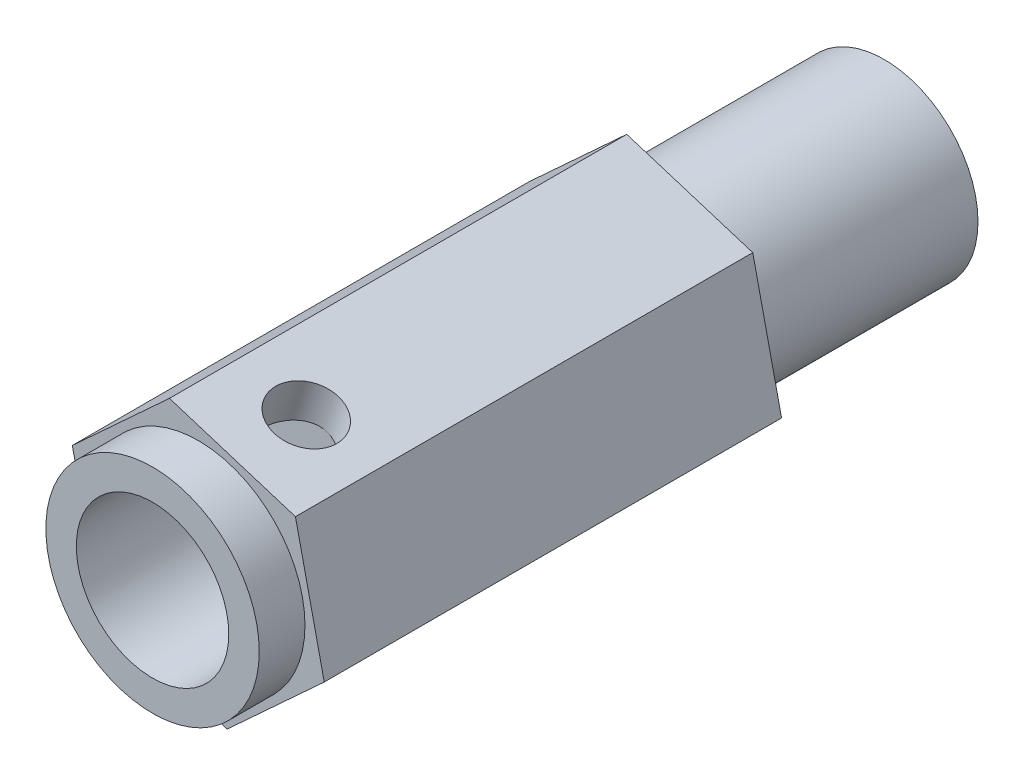
ISO-10303-21;
HEADER;
FILE_DESCRIPTION(('STEP AP214'),'2;1');
FILE_NAME('part.step','',(''),(''),'','','');
FILE_SCHEMA(('AUTOMOTIVE_DESIGN { 1 0 10303 214 1 1 1 1 }'));
ENDSEC;
DATA;
#1=APPLICATION_CONTEXT('core data for automotive mechanical design processes');
#2=APPLICATION_PROTOCOL_DEFINITION('international standard','automotive_design',2000,#1);
#3=PRODUCT_CONTEXT('',#1,'mechanical');
#4=PRODUCT('Part','Part','',(#3));
#5=PRODUCT_RELATED_PRODUCT_CATEGORY('part','',(#4));
#6=PRODUCT_DEFINITION_FORMATION('','',#4);
#7=PRODUCT_DEFINITION_CONTEXT('part definition',#1,'design');
#8=PRODUCT_DEFINITION('design','',#6,#7);
#9=PRODUCT_DEFINITION_SHAPE('','',#8);
#10=(LENGTH_UNIT() NAMED_UNIT(*) SI_UNIT(.MILLI.,.METRE.));
#11=(NAMED_UNIT(*) PLANE_ANGLE_UNIT() SI_UNIT($,.RADIAN.));
#12=(NAMED_UNIT(*) SI_UNIT($,.STERADIAN.) SOLID_ANGLE_UNIT());
#13=UNCERTAINTY_MEASURE_WITH_UNIT(LENGTH_MEASURE(1.E-05),#10,'distance_accuracy_value','');
#14=(GEOMETRIC_REPRESENTATION_CONTEXT(3) GLOBAL_UNCERTAINTY_ASSIGNED_CONTEXT((#13)) GLOBAL_UNIT_ASSIGNED_CONTEXT((#10,
#11,#12)) REPRESENTATION_CONTEXT('',''));
#15=CARTESIAN_POINT('',(0.,0.,0.));
#16=DIRECTION('',(0.,0.,1.));
#17=DIRECTION('',(1.,0.,0.));
#18=AXIS2_PLACEMENT_3D('',#15,#16,#17);
#19=CARTESIAN_POINT('',(6.37393641946305,5.86284355246178,45.));
#20=DIRECTION('',(0.,0.,1.));
#21=DIRECTION('',(1.,0.,0.));
#22=AXIS2_PLACEMENT_3D('',#19,#20,#21);
#23=PLANE('',#22);
#24=DIRECTION('',(-0.218284964488723,0.975885072269351,0.));
#25=VECTOR('',#24,1.);
#26=CARTESIAN_POINT('',(8.26433966457722,-2.58856908513093,45.));
#27=LINE('',#26,#25);
#28=CARTESIAN_POINT('',(8.26433966457722,-2.58856908513093,45.));
#29=VERTEX_POINT('',#28);
#30=CARTESIAN_POINT('',(6.37393641946305,5.86284355246178,45.));
#31=VERTEX_POINT('',#30);
#32=EDGE_CURVE('E131',#29,#31,#27,.T.);
#33=ORIENTED_EDGE('',*,*,#32,.T.);
#34=DIRECTION('',(-0.954283746003632,0.298902211623258,0.));
#35=VECTOR('',#34,1.);
#36=CARTESIAN_POINT('',(6.37393641946305,5.86284355246178,45.));
#37=LINE('',#36,#35);
#38=CARTESIAN_POINT('',(-1.89040324511418,8.45141263759271,45.));
#39=VERTEX_POINT('',#38);
#40=EDGE_CURVE('E89',#31,#39,#37,.T.);
#41=ORIENTED_EDGE('',*,*,#40,.T.);
#42=DIRECTION('',(-0.73599878151491,-0.676982860646094,0.));
#43=VECTOR('',#42,1.);
#44=CARTESIAN_POINT('',(-1.89040324511418,8.45141263759271,45.));
#45=LINE('',#44,#43);
#46=CARTESIAN_POINT('',(-8.26433966457722,2.58856908513093,45.));
#47=VERTEX_POINT('',#46);
#48=EDGE_CURVE('E102',#39,#47,#45,.T.);
#49=ORIENTED_EDGE('',*,*,#48,.T.);
#50=DIRECTION('',(0.218284964488723,-0.975885072269351,0.));
#51=VECTOR('',#50,1.);
#52=CARTESIAN_POINT('',(-8.26433966457722,2.58856908513093,45.));
#53=LINE('',#52,#51);
#54=CARTESIAN_POINT('',(-6.37393641946304,-5.86284355246178,45.));
#55=VERTEX_POINT('',#54);
#56=EDGE_CURVE('E96',#47,#55,#53,.T.);
#57=ORIENTED_EDGE('',*,*,#56,.T.);
#58=DIRECTION('',(0.954283746003632,-0.298902211623258,0.));
#59=VECTOR('',#58,1.);
#60=CARTESIAN_POINT('',(-6.37393641946304,-5.86284355246178,45.));
#61=LINE('',#60,#59);
#62=CARTESIAN_POINT('',(1.89040324511418,-8.45141263759271,45.));
#63=VERTEX_POINT('',#62);
#64=EDGE_CURVE('E100',#55,#63,#61,.T.);
#65=ORIENTED_EDGE('',*,*,#64,.T.);
#66=DIRECTION('',(0.735998781514909,0.676982860646094,0.));
#67=VECTOR('',#66,1.);
#68=CARTESIAN_POINT('',(1.89040324511418,-8.45141263759271,45.));
#69=LINE('',#68,#67);
#70=EDGE_CURVE('E51',#63,#29,#69,.T.);
#71=ORIENTED_EDGE('',*,*,#70,.T.);
#72=EDGE_LOOP('',(#33,#41,#49,#57,#65,#71));
#73=FACE_BOUND('',#72,.T.);
#74=CARTESIAN_POINT('',(0.,0.,45.));
#75=DIRECTION('',(0.,0.,1.));
#76=DIRECTION('',(1.,0.,0.));
#77=AXIS2_PLACEMENT_3D('',#74,#75,#76);
#78=CIRCLE('',#77,7.);
#79=CARTESIAN_POINT('',(7.,0.,45.));
#80=VERTEX_POINT('',#79);
#81=EDGE_CURVE('E189',#80,#80,#78,.T.);
#82=ORIENTED_EDGE('',*,*,#81,.F.);
#83=EDGE_LOOP('',(#82));
#84=FACE_BOUND('',#83,.T.);
#85=ADVANCED_FACE('F34',(#73,#84),#23,.T.);
#86=CARTESIAN_POINT('',(0.,0.,15.));
#87=DIRECTION('',(0.,0.,-1.));
#88=DIRECTION('',(-1.,0.,0.));
#89=AXIS2_PLACEMENT_3D('',#86,#87,#88);
#90=CYLINDRICAL_SURFACE('',#89,6.15);
#91=CARTESIAN_POINT('',(0.,0.,15.));
#92=DIRECTION('',(0.,0.,1.));
#93=DIRECTION('',(1.,0.,0.));
#94=AXIS2_PLACEMENT_3D('',#91,#92,#93);
#95=CIRCLE('',#94,6.15);
#96=CARTESIAN_POINT('',(6.15,0.,15.));
#97=VERTEX_POINT('',#96);
#98=EDGE_CURVE('E11',#97,#97,#95,.T.);
#99=ORIENTED_EDGE('',*,*,#98,.F.);
#100=EDGE_LOOP('',(#99));
#101=FACE_BOUND('',#100,.T.);
#102=CARTESIAN_POINT('',(0.,0.,0.));
#103=DIRECTION('',(0.,0.,1.));
#104=DIRECTION('',(1.,0.,0.));
#105=AXIS2_PLACEMENT_3D('',#102,#103,#104);
#106=CIRCLE('',#105,6.15);
#107=CARTESIAN_POINT('',(6.15,0.,0.));
#108=VERTEX_POINT('',#107);
#109=EDGE_CURVE('E38',#108,#108,#106,.T.);
#110=ORIENTED_EDGE('',*,*,#109,.T.);
#111=EDGE_LOOP('',(#110));
#112=FACE_BOUND('',#111,.T.);
#113=ADVANCED_FACE('F36',(#101,#112),#90,.T.);
#114=CARTESIAN_POINT('',(0.,0.,0.));
#115=DIRECTION('',(0.,0.,1.));
#116=DIRECTION('',(1.,0.,0.));
#117=AXIS2_PLACEMENT_3D('',#114,#115,#116);
#118=PLANE('',#117);
#119=ORIENTED_EDGE('',*,*,#109,.F.);
#120=EDGE_LOOP('',(#119));
#121=FACE_BOUND('',#120,.T.);
#122=ADVANCED_FACE('F144',(#121),#118,.F.);
#123=CARTESIAN_POINT('',(6.37393641946305,5.86284355246178,15.));
#124=DIRECTION('',(0.,0.,1.));
#125=DIRECTION('',(1.,0.,0.));
#126=AXIS2_PLACEMENT_3D('',#123,#124,#125);
#127=PLANE('',#126);
#128=DIRECTION('',(-0.218284964488723,0.975885072269351,0.));
#129=VECTOR('',#128,1.);
#130=CARTESIAN_POINT('',(8.26433966457722,-2.58856908513093,15.));
#131=LINE('',#130,#129);
#132=CARTESIAN_POINT('',(8.26433966457722,-2.58856908513093,15.));
#133=VERTEX_POINT('',#132);
#134=CARTESIAN_POINT('',(6.37393641946305,5.86284355246178,15.));
#135=VERTEX_POINT('',#134);
#136=EDGE_CURVE('E120',#133,#135,#131,.T.);
#137=ORIENTED_EDGE('',*,*,#136,.F.);
#138=DIRECTION('',(0.735998781514909,0.676982860646094,0.));
#139=VECTOR('',#138,1.);
#140=CARTESIAN_POINT('',(1.89040324511418,-8.45141263759271,15.));
#141=LINE('',#140,#139);
#142=CARTESIAN_POINT('',(1.89040324511418,-8.45141263759271,15.));
#143=VERTEX_POINT('',#142);
#144=EDGE_CURVE('E80',#143,#133,#141,.T.);
#145=ORIENTED_EDGE('',*,*,#144,.F.);
#146=DIRECTION('',(0.954283746003632,-0.298902211623258,0.));
#147=VECTOR('',#146,1.);
#148=CARTESIAN_POINT('',(-6.37393641946304,-5.86284355246178,15.));
#149=LINE('',#148,#147);
#150=CARTESIAN_POINT('',(-6.37393641946304,-5.86284355246178,15.));
#151=VERTEX_POINT('',#150);
#152=EDGE_CURVE('E74',#151,#143,#149,.T.);
#153=ORIENTED_EDGE('',*,*,#152,.F.);
#154=DIRECTION('',(0.218284964488723,-0.975885072269351,0.));
#155=VECTOR('',#154,1.);
#156=CARTESIAN_POINT('',(-8.26433966457722,2.58856908513093,15.));
#157=LINE('',#156,#155);
#158=CARTESIAN_POINT('',(-8.26433966457722,2.58856908513093,15.));
#159=VERTEX_POINT('',#158);
#160=EDGE_CURVE('E110',#159,#151,#157,.T.);
#161=ORIENTED_EDGE('',*,*,#160,.F.);
#162=DIRECTION('',(-0.73599878151491,-0.676982860646094,0.));
#163=VECTOR('',#162,1.);
#164=CARTESIAN_POINT('',(-1.89040324511418,8.45141263759271,15.));
#165=LINE('',#164,#163);
#166=CARTESIAN_POINT('',(-1.89040324511418,8.45141263759271,15.));
#167=VERTEX_POINT('',#166);
#168=EDGE_CURVE('E126',#167,#159,#165,.T.);
#169=ORIENTED_EDGE('',*,*,#168,.F.);
#170=DIRECTION('',(-0.954283746003632,0.298902211623258,0.));
#171=VECTOR('',#170,1.);
#172=CARTESIAN_POINT('',(6.37393641946305,5.86284355246178,15.));
#173=LINE('',#172,#171);
#174=EDGE_CURVE('E123',#135,#167,#173,.T.);
#175=ORIENTED_EDGE('',*,*,#174,.F.);
#176=EDGE_LOOP('',(#137,#145,#153,#161,#169,#175));
#177=FACE_BOUND('',#176,.T.);
#178=ORIENTED_EDGE('',*,*,#98,.T.);
#179=EDGE_LOOP('',(#178));
#180=FACE_BOUND('',#179,.T.);
#181=ADVANCED_FACE('F146',(#177,#180),#127,.F.);
#182=CARTESIAN_POINT('',(8.26433966457722,-2.58856908513093,45.));
#183=DIRECTION('',(-0.975885072269351,-0.218284964488723,0.));
#184=DIRECTION('',(0.218284964488723,-0.975885072269352,0.));
#185=AXIS2_PLACEMENT_3D('',#182,#183,#184);
#186=PLANE('',#185);
#187=ORIENTED_EDGE('',*,*,#136,.T.);
#188=DIRECTION('',(0.,0.,-1.));
#189=VECTOR('',#188,1.);
#190=CARTESIAN_POINT('',(6.37393641946305,5.86284355246178,45.));
#191=LINE('',#190,#189);
#192=EDGE_CURVE('E138',#31,#135,#191,.T.);
#193=ORIENTED_EDGE('',*,*,#192,.F.);
#194=ORIENTED_EDGE('',*,*,#32,.F.);
#195=DIRECTION('',(0.,0.,-1.));
#196=VECTOR('',#195,1.);
#197=CARTESIAN_POINT('',(8.26433966457722,-2.58856908513093,45.));
#198=LINE('',#197,#196);
#199=EDGE_CURVE('E116',#29,#133,#198,.T.);
#200=ORIENTED_EDGE('',*,*,#199,.T.);
#201=EDGE_LOOP('',(#187,#193,#194,#200));
#202=FACE_BOUND('',#201,.T.);
#203=ADVANCED_FACE('F151',(#202),#186,.F.);
#204=CARTESIAN_POINT('',(6.37393641946305,5.86284355246178,45.));
#205=DIRECTION('',(-0.298902211623258,-0.954283746003632,0.));
#206=DIRECTION('',(0.954283746003632,-0.298902211623258,0.));
#207=AXIS2_PLACEMENT_3D('',#204,#205,#206);
#208=PLANE('',#207);
#209=CARTESIAN_POINT('',(2.24176658717444,7.15712809502725,40.1583640757079));
#210=DIRECTION('',(0.298902211623258,0.954283746003633,0.));
#211=DIRECTION('',(-0.954283746003633,0.298902211623258,0.));
#212=AXIS2_PLACEMENT_3D('',#209,#210,#211);
#213=CIRCLE('',#212,2.09999999999998);
#214=CARTESIAN_POINT('',(0.237770720566823,7.78482273943608,40.1583640757079));
#215=VERTEX_POINT('',#214);
#216=EDGE_CURVE('E208',#215,#215,#213,.T.);
#217=ORIENTED_EDGE('',*,*,#216,.F.);
#218=EDGE_LOOP('',(#217));
#219=FACE_BOUND('',#218,.T.);
#220=ORIENTED_EDGE('',*,*,#174,.T.);
#221=DIRECTION('',(0.,0.,-1.));
#222=VECTOR('',#221,1.);
#223=CARTESIAN_POINT('',(-1.89040324511418,8.45141263759271,45.));
#224=LINE('',#223,#222);
#225=EDGE_CURVE('E135',#39,#167,#224,.T.);
#226=ORIENTED_EDGE('',*,*,#225,.F.);
#227=ORIENTED_EDGE('',*,*,#40,.F.);
#228=ORIENTED_EDGE('',*,*,#192,.T.);
#229=EDGE_LOOP('',(#220,#226,#227,#228));
#230=FACE_BOUND('',#229,.T.);
#231=ADVANCED_FACE('F174',(#219,#230),#208,.F.);
#232=CARTESIAN_POINT('',(-1.89040324511418,8.45141263759271,45.));
#233=DIRECTION('',(0.676982860646094,-0.73599878151491,0.));
#234=DIRECTION('',(0.73599878151491,0.676982860646094,0.));
#235=AXIS2_PLACEMENT_3D('',#232,#233,#234);
#236=PLANE('',#235);
#237=ORIENTED_EDGE('',*,*,#168,.T.);
#238=DIRECTION('',(0.,0.,-1.));
#239=VECTOR('',#238,1.);
#240=CARTESIAN_POINT('',(-8.26433966457722,2.58856908513093,45.));
#241=LINE('',#240,#239);
#242=EDGE_CURVE('E111',#47,#159,#241,.T.);
#243=ORIENTED_EDGE('',*,*,#242,.F.);
#244=ORIENTED_EDGE('',*,*,#48,.F.);
#245=ORIENTED_EDGE('',*,*,#225,.T.);
#246=EDGE_LOOP('',(#237,#243,#244,#245));
#247=FACE_BOUND('',#246,.T.);
#248=ADVANCED_FACE('F171',(#247),#236,.F.);
#249=CARTESIAN_POINT('',(-8.26433966457722,2.58856908513093,45.));
#250=DIRECTION('',(0.975885072269351,0.218284964488723,0.));
#251=DIRECTION('',(-0.218284964488723,0.975885072269352,0.));
#252=AXIS2_PLACEMENT_3D('',#249,#250,#251);
#253=PLANE('',#252);
#254=ORIENTED_EDGE('',*,*,#160,.T.);
#255=DIRECTION('',(0.,0.,-1.));
#256=VECTOR('',#255,1.);
#257=CARTESIAN_POINT('',(-6.37393641946304,-5.86284355246178,45.));
#258=LINE('',#257,#256);
#259=EDGE_CURVE('E107',#55,#151,#258,.T.);
#260=ORIENTED_EDGE('',*,*,#259,.F.);
#261=ORIENTED_EDGE('',*,*,#56,.F.);
#262=ORIENTED_EDGE('',*,*,#242,.T.);
#263=EDGE_LOOP('',(#254,#260,#261,#262));
#264=FACE_BOUND('',#263,.T.);
#265=ADVANCED_FACE('F108',(#264),#253,.F.);
#266=CARTESIAN_POINT('',(-6.37393641946304,-5.86284355246178,45.));
#267=DIRECTION('',(0.298902211623258,0.954283746003632,0.));
#268=DIRECTION('',(-0.954283746003633,0.298902211623258,0.));
#269=AXIS2_PLACEMENT_3D('',#266,#267,#268);
#270=PLANE('',#269);
#271=ORIENTED_EDGE('',*,*,#152,.T.);
#272=DIRECTION('',(0.,0.,-1.));
#273=VECTOR('',#272,1.);
#274=CARTESIAN_POINT('',(1.89040324511418,-8.45141263759271,45.));
#275=LINE('',#274,#273);
#276=EDGE_CURVE('E112',#63,#143,#275,.T.);
#277=ORIENTED_EDGE('',*,*,#276,.F.);
#278=ORIENTED_EDGE('',*,*,#64,.F.);
#279=ORIENTED_EDGE('',*,*,#259,.T.);
#280=EDGE_LOOP('',(#271,#277,#278,#279));
#281=FACE_BOUND('',#280,.T.);
#282=ADVANCED_FACE('F114',(#281),#270,.F.);
#283=CARTESIAN_POINT('',(1.89040324511418,-8.45141263759271,45.));
#284=DIRECTION('',(-0.676982860646094,0.735998781514909,0.));
#285=DIRECTION('',(-0.735998781514909,-0.676982860646094,0.));
#286=AXIS2_PLACEMENT_3D('',#283,#284,#285);
#287=PLANE('',#286);
#288=ORIENTED_EDGE('',*,*,#144,.T.);
#289=ORIENTED_EDGE('',*,*,#199,.F.);
#290=ORIENTED_EDGE('',*,*,#70,.F.);
#291=ORIENTED_EDGE('',*,*,#276,.T.);
#292=EDGE_LOOP('',(#288,#289,#290,#291));
#293=FACE_BOUND('',#292,.T.);
#294=ADVANCED_FACE('F164',(#293),#287,.F.);
#295=CARTESIAN_POINT('',(0.,0.,48.));
#296=DIRECTION('',(0.,0.,-1.));
#297=DIRECTION('',(-1.,0.,0.));
#298=AXIS2_PLACEMENT_3D('',#295,#296,#297);
#299=CYLINDRICAL_SURFACE('',#298,7.);
#300=CARTESIAN_POINT('',(0.,0.,48.));
#301=DIRECTION('',(0.,0.,1.));
#302=DIRECTION('',(1.,0.,0.));
#303=AXIS2_PLACEMENT_3D('',#300,#301,#302);
#304=CIRCLE('',#303,7.);
#305=CARTESIAN_POINT('',(7.,0.,48.));
#306=VERTEX_POINT('',#305);
#307=EDGE_CURVE('E124',#306,#306,#304,.T.);
#308=ORIENTED_EDGE('',*,*,#307,.F.);
#309=EDGE_LOOP('',(#308));
#310=FACE_BOUND('',#309,.T.);
#311=ORIENTED_EDGE('',*,*,#81,.T.);
#312=EDGE_LOOP('',(#311));
#313=FACE_BOUND('',#312,.T.);
#314=ADVANCED_FACE('F161',(#310,#313),#299,.T.);
#315=CARTESIAN_POINT('',(0.,0.,48.));
#316=DIRECTION('',(0.,0.,1.));
#317=DIRECTION('',(1.,0.,0.));
#318=AXIS2_PLACEMENT_3D('',#315,#316,#317);
#319=PLANE('',#318);
#320=CARTESIAN_POINT('',(0.,0.,48.));
#321=DIRECTION('',(0.,0.,1.));
#322=DIRECTION('',(1.,0.,0.));
#323=AXIS2_PLACEMENT_3D('',#320,#321,#322);
#324=CIRCLE('',#323,5.);
#325=CARTESIAN_POINT('',(5.,0.,48.));
#326=VERTEX_POINT('',#325);
#327=EDGE_CURVE('E195',#326,#326,#324,.T.);
#328=ORIENTED_EDGE('',*,*,#327,.F.);
#329=EDGE_LOOP('',(#328));
#330=FACE_BOUND('',#329,.T.);
#331=ORIENTED_EDGE('',*,*,#307,.T.);
#332=EDGE_LOOP('',(#331));
#333=FACE_BOUND('',#332,.T.);
#334=ADVANCED_FACE('F228',(#330,#333),#319,.T.);
#335=CARTESIAN_POINT('',(0.,0.,38.));
#336=DIRECTION('',(0.,0.,1.));
#337=DIRECTION('',(1.,0.,0.));
#338=AXIS2_PLACEMENT_3D('',#335,#336,#337);
#339=CYLINDRICAL_SURFACE('',#338,5.);
#340=CARTESIAN_POINT('',(-0.647691057129922,4.95787215390977,40.1583640757079));
#341=CARTESIAN_POINT('',(-0.647679746685014,4.95787795042856,40.2702890972874));
#342=CARTESIAN_POINT('',(-0.637844831074265,4.95918935265039,40.3823787062973));
#343=CARTESIAN_POINT('',(-0.599009231699877,4.96402544422643,40.6033250662697));
#344=CARTESIAN_POINT('',(-0.569956888753645,4.96755609796866,40.7121722747346));
#345=CARTESIAN_POINT('',(-0.494339094550999,4.97564631310835,40.9230262756503));
#346=CARTESIAN_POINT('',(-0.447845823449498,4.98020160330606,41.0250592465667));
#347=CARTESIAN_POINT('',(-0.339327426483434,4.98876816774257,41.2204336259409));
#348=CARTESIAN_POINT('',(-0.277305801084515,4.99277956427438,41.3137769867497));
#349=CARTESIAN_POINT('',(-0.135840086433892,4.99868303692281,41.4950813190127));
#350=CARTESIAN_POINT('',(-0.0556006857197908,5.0004403454895,41.5824264089627));
#351=CARTESIAN_POINT('',(0.117507426539164,4.99936803026637,41.7435798766386));
#352=CARTESIAN_POINT('',(0.210381028888948,4.99653662549211,41.8173829860351));
#353=CARTESIAN_POINT('',(0.410520226089492,4.98416971183633,41.9525163736662));
#354=CARTESIAN_POINT('',(0.518240477330134,4.97434344242649,42.0131512543821));
#355=CARTESIAN_POINT('',(0.741267927308833,4.94602139996441,42.1155063691805));
#356=CARTESIAN_POINT('',(0.856571679922349,4.92752954168135,42.1572351275736));
#357=CARTESIAN_POINT('',(1.08466516508413,4.88224309921251,42.2183537594421));
#358=CARTESIAN_POINT('',(1.19726644108904,4.85593818416212,42.2388063257877));
#359=CARTESIAN_POINT('',(1.42203015303675,4.79493148489914,42.2602282615207));
#360=CARTESIAN_POINT('',(1.53419275090849,4.76023317050685,42.2612056680293));
#361=CARTESIAN_POINT('',(1.74757397949963,4.68593304805614,42.244201088039));
#362=CARTESIAN_POINT('',(1.84904051804714,4.64676696532649,42.2273874038258));
#363=CARTESIAN_POINT('',(2.04571438473508,4.56360133616346,42.1772838438123));
#364=CARTESIAN_POINT('',(2.14092125050043,4.5196014333163,42.1439927524422));
#365=CARTESIAN_POINT('',(2.32439618092366,4.42807664355122,42.0614869913281));
#366=CARTESIAN_POINT('',(2.41253601970494,4.38050817404799,42.0120368240621));
#367=CARTESIAN_POINT('',(2.57874142695117,4.28477597944832,41.8988496309581));
#368=CARTESIAN_POINT('',(2.65680340142572,4.23661204867001,41.8351075303556));
#369=CARTESIAN_POINT('',(2.80699387436972,4.13876602470118,41.6898508243155));
#370=CARTESIAN_POINT('',(2.87829975061441,4.08922139114795,41.6073917017566));
#371=CARTESIAN_POINT('',(3.00720982176652,3.99537984142629,41.4297000334272));
#372=CARTESIAN_POINT('',(3.06480855931895,3.95108501892702,41.334462423555));
#373=CARTESIAN_POINT('',(3.16712743903265,3.86959137562495,41.1298500813839));
#374=CARTESIAN_POINT('',(3.21134567235172,3.83268349070992,41.0201059464267));
#375=CARTESIAN_POINT('',(3.28317632176318,3.77134070885286,40.7920423909396));
#376=CARTESIAN_POINT('',(3.31080083402436,3.74689672818525,40.6737292875233));
#377=CARTESIAN_POINT('',(3.34739591747529,3.71423040000581,40.4401691655993));
#378=CARTESIAN_POINT('',(3.35747155822612,3.70504888877657,40.3252303624148));
#379=CARTESIAN_POINT('',(3.36209298042571,3.70085770027618,40.0948020086178));
#380=CARTESIAN_POINT('',(3.35664427992223,3.70584298748727,39.9793126682591));
#381=CARTESIAN_POINT('',(3.33128049870742,3.72864868282145,39.7590367884938));
#382=CARTESIAN_POINT('',(3.31233650761293,3.74560685540865,39.6540447420166));
#383=CARTESIAN_POINT('',(3.26155441648134,3.78990627422391,39.44952460338));
#384=CARTESIAN_POINT('',(3.22971327020885,3.81724997335971,39.3499978083932));
#385=CARTESIAN_POINT('',(3.15214046584313,3.88157762337454,39.1544838921185));
#386=CARTESIAN_POINT('',(3.10587396379246,3.9189232102097,39.0588291384064));
#387=CARTESIAN_POINT('',(3.00072079629403,4.000009825983,38.8776947894277));
#388=CARTESIAN_POINT('',(2.94182860618106,4.04375365194929,38.7922196740506));
#389=CARTESIAN_POINT('',(2.8067467065111,4.13878404378055,38.6264880761206));
#390=CARTESIAN_POINT('',(2.7295272240225,4.1903952978459,38.5472530290461));
#391=CARTESIAN_POINT('',(2.56220269019894,4.2947443305633,38.4046733110981));
#392=CARTESIAN_POINT('',(2.47209660281324,4.34748219950208,38.3413299190028));
#393=CARTESIAN_POINT('',(2.2802553770835,4.45110579401834,38.2323635119159));
#394=CARTESIAN_POINT('',(2.17848408173265,4.5019850790941,38.1867976322368));
#395=CARTESIAN_POINT('',(1.96600757326435,4.59873956054757,38.1155460005885));
#396=CARTESIAN_POINT('',(1.85530781711952,4.64461777379835,38.0898482056409));
#397=CARTESIAN_POINT('',(1.63639528454696,4.7259788458932,38.0605965269163));
#398=CARTESIAN_POINT('',(1.52856168383215,4.76196783001089,38.0556031688366));
#399=CARTESIAN_POINT('',(1.31135749530094,4.82629890903391,38.0640181251544));
#400=CARTESIAN_POINT('',(1.20198718816175,4.85464238176009,38.0774231212741));
#401=CARTESIAN_POINT('',(0.989103031690351,4.90236221222191,38.1212207665105));
#402=CARTESIAN_POINT('',(0.885521079503878,4.92202794434816,38.1509759364436));
#403=CARTESIAN_POINT('',(0.682949896367064,4.95420103245963,38.2259276772314));
#404=CARTESIAN_POINT('',(0.583961534519793,4.96670703886462,38.2711271567155));
#405=CARTESIAN_POINT('',(0.388766765235408,4.9858714742757,38.3779726477124));
#406=CARTESIAN_POINT('',(0.29288994962632,4.99223908546181,38.4402713921063));
#407=CARTESIAN_POINT('',(0.111373087221965,4.99958614361471,38.5786006525258));
#408=CARTESIAN_POINT('',(0.0257369341314328,5.00056354744929,38.6546363642063));
#409=CARTESIAN_POINT('',(-0.138535444294945,4.9988018025429,38.8245037073826));
#410=CARTESIAN_POINT('',(-0.216274822488395,4.99580030365958,38.9192036219899));
#411=CARTESIAN_POINT('',(-0.354761276736811,4.98788227285287,39.12032718326));
#412=CARTESIAN_POINT('',(-0.415498756215409,4.98296466312749,39.2267574039511));
#413=CARTESIAN_POINT('',(-0.517019128875985,4.9734609071568,39.4483436888009));
#414=CARTESIAN_POINT('',(-0.557889606960127,4.96887338343191,39.5634588204801));
#415=CARTESIAN_POINT('',(-0.602738145796796,4.96355869156913,39.7400356846438));
#416=CARTESIAN_POINT('',(-0.614940937203827,4.96204892922035,39.7994861957788));
#417=CARTESIAN_POINT('',(-0.633729398564422,4.95968591832975,39.9192709480751));
#418=CARTESIAN_POINT('',(-0.640318980925612,4.95883221255706,39.9796045438421));
#419=CARTESIAN_POINT('',(-0.646478028401506,4.95803034420063,40.0794657760307));
#420=CARTESIAN_POINT('',(-0.647695044648698,4.95787011033609,40.1189046973499));
#421=CARTESIAN_POINT('',(-0.647691057129922,4.95787215390977,40.1583640757079));
#422=B_SPLINE_CURVE_WITH_KNOTS('',3,(#340,#341,#342,#343,#344,#345,#346,#347,#348,#349,#350,
#351,#352,#353,#354,#355,#356,#357,#358,#359,#360,#361,#362,#363,#364,#365,#366,#367,#368,#369,
#370,#371,#372,#373,#374,#375,#376,#377,#378,#379,#380,#381,#382,#383,#384,#385,#386,#387,#388,
#389,#390,#391,#392,#393,#394,#395,#396,#397,#398,#399,#400,#401,#402,#403,#404,#405,#406,#407,
#408,#409,#410,#411,#412,#413,#414,#415,#416,#417,#418,#419,#420,#421),.UNSPECIFIED.,.T.,.F.,(4,
2,2,2,2,2,2,2,2,2,2,2,2,2,2,2,2,2,2,2,2,2,2,2,2,2,2,2,2,2,2,2,2,2,2,2,2,2,2,2,4),(0.,
0.335635656606172,0.672177236307951,1.00734111814835,1.3424295138839,1.6967392497788,
2.05118653430913,2.42129877812725,2.79124398086995,3.14166571369556,3.49194282946522,
3.8205664093721,4.14921423608073,4.48288287547886,4.81667018174634,5.17430973536722,
5.53209144212973,5.90198342971281,6.27160545236005,6.61697414039904,6.96222008421918,
7.28484865641394,7.60755347613729,7.94403128513026,8.28065662947252,8.64521235173307,
9.00979739985341,9.3755447243789,9.74107017809819,10.0807065690479,10.420281712137,
10.7474704702579,11.0747208818872,11.4168078835366,11.7590245427135,12.1249656183701,
12.4911128317485,12.8556308833964,13.0375398024423,13.2193218269542,13.3376508134272),.UNSPECIFIED.);
#423=CARTESIAN_POINT('',(-0.647691057129922,4.95787215390977,40.1583640757079));
#424=VERTEX_POINT('',#423);
#425=EDGE_CURVE('E198',#424,#424,#422,.T.);
#426=ORIENTED_EDGE('',*,*,#425,.T.);
#427=EDGE_LOOP('',(#426));
#428=FACE_BOUND('',#427,.T.);
#429=CARTESIAN_POINT('',(0.,0.,38.));
#430=DIRECTION('',(0.,0.,1.));
#431=DIRECTION('',(1.,0.,0.));
#432=AXIS2_PLACEMENT_3D('',#429,#430,#431);
#433=CIRCLE('',#432,5.);
#434=CARTESIAN_POINT('',(5.,0.,38.));
#435=VERTEX_POINT('',#434);
#436=EDGE_CURVE('E192',#435,#435,#433,.T.);
#437=ORIENTED_EDGE('',*,*,#436,.F.);
#438=EDGE_LOOP('',(#437));
#439=FACE_BOUND('',#438,.T.);
#440=ORIENTED_EDGE('',*,*,#327,.T.);
#441=EDGE_LOOP('',(#440));
#442=FACE_BOUND('',#441,.T.);
#443=ADVANCED_FACE('F219',(#428,#439,#442),#339,.F.);
#444=CARTESIAN_POINT('',(0.,0.,38.));
#445=DIRECTION('',(0.,0.,1.));
#446=DIRECTION('',(1.,0.,0.));
#447=AXIS2_PLACEMENT_3D('',#444,#445,#446);
#448=PLANE('',#447);
#449=ORIENTED_EDGE('',*,*,#436,.T.);
#450=EDGE_LOOP('',(#449));
#451=FACE_BOUND('',#450,.T.);
#452=ADVANCED_FACE('F214',(#451),#448,.T.);
#453=CARTESIAN_POINT('',(2.24176658717444,7.15712809502725,40.1583640757079));
#454=DIRECTION('',(0.298902211623258,0.954283746003633,0.));
#455=DIRECTION('',(-0.954283746003633,0.298902211623258,0.));
#456=AXIS2_PLACEMENT_3D('',#453,#454,#455);
#457=CYLINDRICAL_SURFACE('',#456,2.09999999999999);
#458=ORIENTED_EDGE('',*,*,#425,.F.);
#459=EDGE_LOOP('',(#458));
#460=FACE_BOUND('',#459,.T.);
#461=ORIENTED_EDGE('',*,*,#216,.T.);
#462=EDGE_LOOP('',(#461));
#463=FACE_BOUND('',#462,.T.);
#464=ADVANCED_FACE('F211',(#460,#463),#457,.F.);
#465=CLOSED_SHELL('',(#85,#113,#122,#181,#203,#231,#248,#265,#282,#294,#314,#334,#443,#452,#464));
#466=MANIFOLD_SOLID_BREP('B2',#465);
#467=ADVANCED_BREP_SHAPE_REPRESENTATION('',(#18,#466),#14);
#468=SHAPE_DEFINITION_REPRESENTATION(#9,#467);
ENDSEC;
END-ISO-10303-21;
